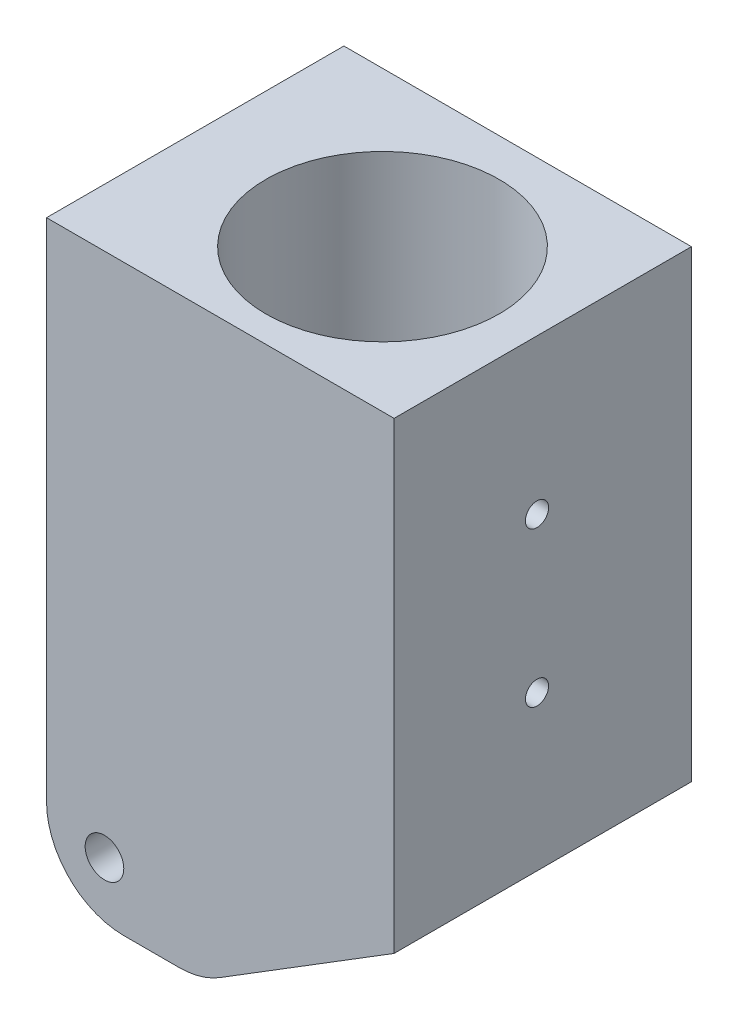
ISO-10303-21;
HEADER;
FILE_DESCRIPTION(('STEP AP214'),'2;1');
FILE_NAME('part.step','',(''),(''),'','','');
FILE_SCHEMA(('AUTOMOTIVE_DESIGN { 1 0 10303 214 1 1 1 1 }'));
ENDSEC;
DATA;
#1=APPLICATION_CONTEXT('core data for automotive mechanical design processes');
#2=APPLICATION_PROTOCOL_DEFINITION('international standard','automotive_design',2000,#1);
#3=PRODUCT_CONTEXT('',#1,'mechanical');
#4=PRODUCT('Part','Part','',(#3));
#5=PRODUCT_RELATED_PRODUCT_CATEGORY('part','',(#4));
#6=PRODUCT_DEFINITION_FORMATION('','',#4);
#7=PRODUCT_DEFINITION_CONTEXT('part definition',#1,'design');
#8=PRODUCT_DEFINITION('design','',#6,#7);
#9=PRODUCT_DEFINITION_SHAPE('','',#8);
#10=(LENGTH_UNIT() NAMED_UNIT(*) SI_UNIT(.MILLI.,.METRE.));
#11=(NAMED_UNIT(*) PLANE_ANGLE_UNIT() SI_UNIT($,.RADIAN.));
#12=(NAMED_UNIT(*) SI_UNIT($,.STERADIAN.) SOLID_ANGLE_UNIT());
#13=UNCERTAINTY_MEASURE_WITH_UNIT(LENGTH_MEASURE(1.E-05),#10,'distance_accuracy_value','');
#14=(GEOMETRIC_REPRESENTATION_CONTEXT(3) GLOBAL_UNCERTAINTY_ASSIGNED_CONTEXT((#13)) GLOBAL_UNIT_ASSIGNED_CONTEXT((#10,
#11,#12)) REPRESENTATION_CONTEXT('',''));
#15=CARTESIAN_POINT('',(0.,0.,0.));
#16=DIRECTION('',(0.,0.,1.));
#17=DIRECTION('',(1.,0.,0.));
#18=AXIS2_PLACEMENT_3D('',#15,#16,#17);
#19=CARTESIAN_POINT('',(20.,60.,-20.));
#20=DIRECTION('',(-1.,0.,0.));
#21=DIRECTION('',(0.,0.,1.));
#22=AXIS2_PLACEMENT_3D('',#19,#20,#21);
#23=PLANE('',#22);
#24=CARTESIAN_POINT('',(20.,40.,0.));
#25=DIRECTION('',(1.,0.,0.));
#26=DIRECTION('',(0.,0.,-1.));
#27=AXIS2_PLACEMENT_3D('',#24,#25,#26);
#28=CIRCLE('',#27,1.5);
#29=CARTESIAN_POINT('',(20.,40.,-1.5));
#30=VERTEX_POINT('',#29);
#31=EDGE_CURVE('E256',#30,#30,#28,.T.);
#32=ORIENTED_EDGE('',*,*,#31,.F.);
#33=EDGE_LOOP('',(#32));
#34=FACE_BOUND('',#33,.T.);
#35=CARTESIAN_POINT('',(20.,20.,0.));
#36=DIRECTION('',(1.,0.,0.));
#37=DIRECTION('',(0.,0.,-1.));
#38=AXIS2_PLACEMENT_3D('',#35,#36,#37);
#39=CIRCLE('',#38,1.5);
#40=CARTESIAN_POINT('',(20.,20.,-1.5));
#41=VERTEX_POINT('',#40);
#42=EDGE_CURVE('E246',#41,#41,#39,.T.);
#43=ORIENTED_EDGE('',*,*,#42,.F.);
#44=EDGE_LOOP('',(#43));
#45=FACE_BOUND('',#44,.T.);
#46=DIRECTION('',(0.,0.,-1.));
#47=VECTOR('',#46,1.);
#48=CARTESIAN_POINT('',(20.,0.,-20.));
#49=LINE('',#48,#47);
#50=CARTESIAN_POINT('',(20.,0.,18.5));
#51=VERTEX_POINT('',#50);
#52=CARTESIAN_POINT('',(20.,0.,13.5));
#53=VERTEX_POINT('',#52);
#54=EDGE_CURVE('E111',#51,#53,#49,.T.);
#55=ORIENTED_EDGE('',*,*,#54,.T.);
#56=CARTESIAN_POINT('',(20.,0.,-20.));
#57=VERTEX_POINT('',#56);
#58=EDGE_CURVE('E128',#53,#57,#49,.T.);
#59=ORIENTED_EDGE('',*,*,#58,.T.);
#60=DIRECTION('',(0.,-1.,0.));
#61=VECTOR('',#60,1.);
#62=CARTESIAN_POINT('',(20.,60.,-20.));
#63=LINE('',#62,#61);
#64=CARTESIAN_POINT('',(20.,60.,-20.));
#65=VERTEX_POINT('',#64);
#66=EDGE_CURVE('E154',#65,#57,#63,.T.);
#67=ORIENTED_EDGE('',*,*,#66,.F.);
#68=DIRECTION('',(0.,0.,-1.));
#69=VECTOR('',#68,1.);
#70=CARTESIAN_POINT('',(20.,60.,-20.));
#71=LINE('',#70,#69);
#72=CARTESIAN_POINT('',(20.,60.,18.5));
#73=VERTEX_POINT('',#72);
#74=EDGE_CURVE('E146',#73,#65,#71,.T.);
#75=ORIENTED_EDGE('',*,*,#74,.F.);
#76=DIRECTION('',(0.,-1.,0.));
#77=VECTOR('',#76,1.);
#78=CARTESIAN_POINT('',(20.,60.,18.5));
#79=LINE('',#78,#77);
#80=EDGE_CURVE('E138',#73,#51,#79,.T.);
#81=ORIENTED_EDGE('',*,*,#80,.T.);
#82=EDGE_LOOP('',(#55,#59,#67,#75,#81));
#83=FACE_BOUND('',#82,.T.);
#84=ADVANCED_FACE('F39',(#34,#45,#83),#23,.F.);
#85=CARTESIAN_POINT('',(-25.,60.,-20.));
#86=DIRECTION('',(0.,0.,1.));
#87=DIRECTION('',(1.,0.,0.));
#88=AXIS2_PLACEMENT_3D('',#85,#86,#87);
#89=PLANE('',#88);
#90=DIRECTION('',(-1.,0.,0.));
#91=VECTOR('',#90,1.);
#92=CARTESIAN_POINT('',(-25.,0.,-20.));
#93=LINE('',#92,#91);
#94=CARTESIAN_POINT('',(-25.,0.,-20.));
#95=VERTEX_POINT('',#94);
#96=EDGE_CURVE('E130',#57,#95,#93,.T.);
#97=ORIENTED_EDGE('',*,*,#96,.T.);
#98=DIRECTION('',(0.,-1.,0.));
#99=VECTOR('',#98,1.);
#100=CARTESIAN_POINT('',(-25.,60.,-20.));
#101=LINE('',#100,#99);
#102=CARTESIAN_POINT('',(-25.,60.,-20.));
#103=VERTEX_POINT('',#102);
#104=EDGE_CURVE('E151',#103,#95,#101,.T.);
#105=ORIENTED_EDGE('',*,*,#104,.F.);
#106=DIRECTION('',(-1.,0.,0.));
#107=VECTOR('',#106,1.);
#108=CARTESIAN_POINT('',(-25.,60.,-20.));
#109=LINE('',#108,#107);
#110=EDGE_CURVE('E284',#65,#103,#109,.T.);
#111=ORIENTED_EDGE('',*,*,#110,.F.);
#112=ORIENTED_EDGE('',*,*,#66,.T.);
#113=EDGE_LOOP('',(#97,#105,#111,#112));
#114=FACE_BOUND('',#113,.T.);
#115=ADVANCED_FACE('F207',(#114),#89,.F.);
#116=CARTESIAN_POINT('',(-25.,60.,-20.));
#117=DIRECTION('',(1.,0.,0.));
#118=DIRECTION('',(0.,0.,-1.));
#119=AXIS2_PLACEMENT_3D('',#116,#117,#118);
#120=PLANE('',#119);
#121=CARTESIAN_POINT('',(-25.,40.,0.));
#122=DIRECTION('',(1.,0.,0.));
#123=DIRECTION('',(0.,0.,-1.));
#124=AXIS2_PLACEMENT_3D('',#121,#122,#123);
#125=CIRCLE('',#124,1.5);
#126=CARTESIAN_POINT('',(-25.,40.,-1.5));
#127=VERTEX_POINT('',#126);
#128=EDGE_CURVE('E252',#127,#127,#125,.T.);
#129=ORIENTED_EDGE('',*,*,#128,.T.);
#130=EDGE_LOOP('',(#129));
#131=FACE_BOUND('',#130,.T.);
#132=CARTESIAN_POINT('',(-25.,20.,0.));
#133=DIRECTION('',(1.,0.,0.));
#134=DIRECTION('',(0.,0.,-1.));
#135=AXIS2_PLACEMENT_3D('',#132,#133,#134);
#136=CIRCLE('',#135,1.5);
#137=CARTESIAN_POINT('',(-25.,20.,-1.5));
#138=VERTEX_POINT('',#137);
#139=EDGE_CURVE('E166',#138,#138,#136,.T.);
#140=ORIENTED_EDGE('',*,*,#139,.T.);
#141=EDGE_LOOP('',(#140));
#142=FACE_BOUND('',#141,.T.);
#143=DIRECTION('',(0.,-1.,0.));
#144=VECTOR('',#143,1.);
#145=CARTESIAN_POINT('',(-25.,0.,13.5));
#146=LINE('',#145,#144);
#147=CARTESIAN_POINT('',(-25.,0.,13.5));
#148=VERTEX_POINT('',#147);
#149=CARTESIAN_POINT('',(-25.,-5.50000000000001,13.5));
#150=VERTEX_POINT('',#149);
#151=EDGE_CURVE('E121',#148,#150,#146,.T.);
#152=ORIENTED_EDGE('',*,*,#151,.T.);
#153=DIRECTION('',(0.,0.,1.));
#154=VECTOR('',#153,1.);
#155=CARTESIAN_POINT('',(-25.,-5.50000000000001,18.5));
#156=LINE('',#155,#154);
#157=CARTESIAN_POINT('',(-25.,-5.50000000000001,18.5));
#158=VERTEX_POINT('',#157);
#159=EDGE_CURVE('E11',#150,#158,#156,.T.);
#160=ORIENTED_EDGE('',*,*,#159,.T.);
#161=DIRECTION('',(0.,-1.,0.));
#162=VECTOR('',#161,1.);
#163=CARTESIAN_POINT('',(-25.,60.,18.5));
#164=LINE('',#163,#162);
#165=CARTESIAN_POINT('',(-25.,60.,18.5));
#166=VERTEX_POINT('',#165);
#167=EDGE_CURVE('E148',#166,#158,#164,.T.);
#168=ORIENTED_EDGE('',*,*,#167,.F.);
#169=DIRECTION('',(0.,0.,1.));
#170=VECTOR('',#169,1.);
#171=CARTESIAN_POINT('',(-25.,60.,-20.));
#172=LINE('',#171,#170);
#173=EDGE_CURVE('E285',#103,#166,#172,.T.);
#174=ORIENTED_EDGE('',*,*,#173,.F.);
#175=ORIENTED_EDGE('',*,*,#104,.T.);
#176=DIRECTION('',(0.,0.,1.));
#177=VECTOR('',#176,1.);
#178=CARTESIAN_POINT('',(-25.,0.,-20.));
#179=LINE('',#178,#177);
#180=EDGE_CURVE('E139',#95,#148,#179,.T.);
#181=ORIENTED_EDGE('',*,*,#180,.T.);
#182=EDGE_LOOP('',(#152,#160,#168,#174,#175,#181));
#183=FACE_BOUND('',#182,.T.);
#184=ADVANCED_FACE('F213',(#131,#142,#183),#120,.F.);
#185=CARTESIAN_POINT('',(-25.,60.,18.5));
#186=DIRECTION('',(0.,0.,-1.));
#187=DIRECTION('',(-1.,0.,0.));
#188=AXIS2_PLACEMENT_3D('',#185,#186,#187);
#189=PLANE('',#188);
#190=DIRECTION('',(1.,0.,0.));
#191=VECTOR('',#190,1.);
#192=CARTESIAN_POINT('',(-25.,-15.5,18.5));
#193=LINE('',#192,#191);
#194=CARTESIAN_POINT('',(-15.,-15.5,18.5));
#195=VERTEX_POINT('',#194);
#196=CARTESIAN_POINT('',(-7.84847236139706,-15.5,18.5));
#197=VERTEX_POINT('',#196);
#198=EDGE_CURVE('E270',#195,#197,#193,.T.);
#199=ORIENTED_EDGE('',*,*,#198,.T.);
#200=CARTESIAN_POINT('',(-7.84847236139706,-5.5,18.5));
#201=DIRECTION('',(0.,0.,-1.));
#202=DIRECTION('',(-1.,0.,0.));
#203=AXIS2_PLACEMENT_3D('',#200,#201,#202);
#204=CIRCLE('',#203,10.);
#205=CARTESIAN_POINT('',(-2.57907567278031,-13.9990269171238,18.5));
#206=VERTEX_POINT('',#205);
#207=EDGE_CURVE('E235',#197,#206,#204,.F.);
#208=ORIENTED_EDGE('',*,*,#207,.T.);
#209=DIRECTION('',(0.849902691712379,0.526939668861675,0.));
#210=VECTOR('',#209,1.);
#211=CARTESIAN_POINT('',(-4.99999999999999,-15.5,18.5));
#212=LINE('',#211,#210);
#213=EDGE_CURVE('E125',#206,#51,#212,.T.);
#214=ORIENTED_EDGE('',*,*,#213,.T.);
#215=ORIENTED_EDGE('',*,*,#80,.F.);
#216=DIRECTION('',(1.,0.,0.));
#217=VECTOR('',#216,1.);
#218=CARTESIAN_POINT('',(-25.,60.,18.5));
#219=LINE('',#218,#217);
#220=EDGE_CURVE('E142',#166,#73,#219,.T.);
#221=ORIENTED_EDGE('',*,*,#220,.F.);
#222=ORIENTED_EDGE('',*,*,#167,.T.);
#223=CARTESIAN_POINT('',(-15.,-5.50000000000001,18.5));
#224=DIRECTION('',(0.,0.,-1.));
#225=DIRECTION('',(-1.,0.,0.));
#226=AXIS2_PLACEMENT_3D('',#223,#224,#225);
#227=CIRCLE('',#226,10.);
#228=EDGE_CURVE('E237',#158,#195,#227,.F.);
#229=ORIENTED_EDGE('',*,*,#228,.T.);
#230=EDGE_LOOP('',(#199,#208,#214,#215,#221,#222,#229));
#231=FACE_BOUND('',#230,.T.);
#232=CARTESIAN_POINT('',(-17.5,-8.00000000000001,18.5));
#233=DIRECTION('',(0.,0.,1.));
#234=DIRECTION('',(1.,0.,0.));
#235=AXIS2_PLACEMENT_3D('',#232,#233,#234);
#236=CIRCLE('',#235,2.5);
#237=CARTESIAN_POINT('',(-15.,-8.00000000000001,18.5));
#238=VERTEX_POINT('',#237);
#239=EDGE_CURVE('E271',#238,#238,#236,.T.);
#240=ORIENTED_EDGE('',*,*,#239,.F.);
#241=EDGE_LOOP('',(#240));
#242=FACE_BOUND('',#241,.T.);
#243=ADVANCED_FACE('F292',(#231,#242),#189,.F.);
#244=CARTESIAN_POINT('',(0.,60.,0.));
#245=DIRECTION('',(0.,1.,0.));
#246=DIRECTION('',(0.,0.,1.));
#247=AXIS2_PLACEMENT_3D('',#244,#245,#246);
#248=PLANE('',#247);
#249=CARTESIAN_POINT('',(0.,60.,0.));
#250=DIRECTION('',(0.,1.,0.));
#251=DIRECTION('',(0.,0.,1.));
#252=AXIS2_PLACEMENT_3D('',#249,#250,#251);
#253=CIRCLE('',#252,15.1);
#254=CARTESIAN_POINT('',(0.,60.,15.1));
#255=VERTEX_POINT('',#254);
#256=EDGE_CURVE('E114',#255,#255,#253,.T.);
#257=ORIENTED_EDGE('',*,*,#256,.F.);
#258=EDGE_LOOP('',(#257));
#259=FACE_BOUND('',#258,.T.);
#260=ORIENTED_EDGE('',*,*,#74,.T.);
#261=ORIENTED_EDGE('',*,*,#110,.T.);
#262=ORIENTED_EDGE('',*,*,#173,.T.);
#263=ORIENTED_EDGE('',*,*,#220,.T.);
#264=EDGE_LOOP('',(#260,#261,#262,#263));
#265=FACE_BOUND('',#264,.T.);
#266=ADVANCED_FACE('F290',(#259,#265),#248,.T.);
#267=CARTESIAN_POINT('',(0.,0.,0.));
#268=DIRECTION('',(0.,1.,0.));
#269=DIRECTION('',(0.,0.,1.));
#270=AXIS2_PLACEMENT_3D('',#267,#268,#269);
#271=PLANE('',#270);
#272=ORIENTED_EDGE('',*,*,#58,.F.);
#273=DIRECTION('',(-1.,0.,0.));
#274=VECTOR('',#273,1.);
#275=CARTESIAN_POINT('',(20.,0.,13.5));
#276=LINE('',#275,#274);
#277=EDGE_CURVE('E118',#53,#148,#276,.T.);
#278=ORIENTED_EDGE('',*,*,#277,.T.);
#279=ORIENTED_EDGE('',*,*,#180,.F.);
#280=ORIENTED_EDGE('',*,*,#96,.F.);
#281=EDGE_LOOP('',(#272,#278,#279,#280));
#282=FACE_BOUND('',#281,.T.);
#283=ADVANCED_FACE('F129',(#282),#271,.F.);
#284=CARTESIAN_POINT('',(0.,9.99999999999999,0.));
#285=DIRECTION('',(0.,1.,0.));
#286=DIRECTION('',(0.,0.,1.));
#287=AXIS2_PLACEMENT_3D('',#284,#285,#286);
#288=CYLINDRICAL_SURFACE('',#287,15.1);
#289=CARTESIAN_POINT('',(-15.0253119767944,40.,-1.5));
#290=CARTESIAN_POINT('',(-15.025312956074,39.9159676620919,-1.49999635854613));
#291=CARTESIAN_POINT('',(-15.0260245276725,39.8318796909114,-1.49291478510042));
#292=CARTESIAN_POINT('',(-15.028793551497,39.6660349131521,-1.46477185820528));
#293=CARTESIAN_POINT('',(-15.03085248871,39.5842807826705,-1.44369507968879));
#294=CARTESIAN_POINT('',(-15.0360807748948,39.4255293978987,-1.38818135253405));
#295=CARTESIAN_POINT('',(-15.0392494524589,39.3485293004147,-1.35375248074173));
#296=CARTESIAN_POINT('',(-15.0463393621317,39.201417488061,-1.27252733745513));
#297=CARTESIAN_POINT('',(-15.05026044424,39.1313044043924,-1.22573353035035));
#298=CARTESIAN_POINT('',(-15.0584291270942,38.9996884271419,-1.12092628167147));
#299=CARTESIAN_POINT('',(-15.0626777301768,38.9382137328839,-1.06287750232365));
#300=CARTESIAN_POINT('',(-15.0710136412484,38.8258623723675,-0.937283575420635));
#301=CARTESIAN_POINT('',(-15.0751009418651,38.7749861900552,-0.869737994461097));
#302=CARTESIAN_POINT('',(-15.0826635983521,38.6851787557144,-0.72689531541232));
#303=CARTESIAN_POINT('',(-15.0861376707466,38.6462724329321,-0.651582470180894));
#304=CARTESIAN_POINT('',(-15.0920715347339,38.5816686124249,-0.495452469131725));
#305=CARTESIAN_POINT('',(-15.0945313507482,38.5559707966588,-0.414635445899537));
#306=CARTESIAN_POINT('',(-15.0981525138302,38.5185960854439,-0.250075883600477));
#307=CARTESIAN_POINT('',(-15.0993181456551,38.5068729134921,-0.166343950618246));
#308=CARTESIAN_POINT('',(-15.100234174601,38.4976370858915,0.00190655759439224));
#309=CARTESIAN_POINT('',(-15.0999846079687,38.5001240662856,0.0864251126221104));
#310=CARTESIAN_POINT('',(-15.0981018679929,38.5192003682383,0.253535560434281));
#311=CARTESIAN_POINT('',(-15.0964735769364,38.5357399280402,0.336133196401713));
#312=CARTESIAN_POINT('',(-15.0920219994832,38.5823743756564,0.497374352123941));
#313=CARTESIAN_POINT('',(-15.0891986977396,38.612469437557,0.576017821082989));
#314=CARTESIAN_POINT('',(-15.0826661343107,38.685415201237,0.727275160741129));
#315=CARTESIAN_POINT('',(-15.0789553445811,38.7282879348315,0.799878337650498));
#316=CARTESIAN_POINT('',(-15.0710642123586,38.8255560438999,0.936877465459625));
#317=CARTESIAN_POINT('',(-15.0668838562791,38.879951752825,1.00127317876582));
#318=CARTESIAN_POINT('',(-15.0585014337633,38.9990016032106,1.12032085957513));
#319=CARTESIAN_POINT('',(-15.054299351531,39.0636990304483,1.17492954862421));
#320=CARTESIAN_POINT('',(-15.0463651004589,39.201365684078,1.27251801061355));
#321=CARTESIAN_POINT('',(-15.0426329322861,39.2743349222103,1.31549776704826));
#322=CARTESIAN_POINT('',(-15.0360607178808,39.426507005085,1.38860805601259));
#323=CARTESIAN_POINT('',(-15.0332208560381,39.505711134007,1.41873593323833));
#324=CARTESIAN_POINT('',(-15.0287585753405,39.6680883326636,1.46525308871646));
#325=CARTESIAN_POINT('',(-15.0271361198954,39.7512612830321,1.48164277988374));
#326=CARTESIAN_POINT('',(-15.0252986591232,39.9188352636901,1.50016268663854));
#327=CARTESIAN_POINT('',(-15.0250776785925,40.0032295405848,1.50235344042828));
#328=CARTESIAN_POINT('',(-15.0260524182927,40.1711840102969,1.49257225368717));
#329=CARTESIAN_POINT('',(-15.0272481196383,40.2547442142182,1.48060050195128));
#330=CARTESIAN_POINT('',(-15.0309160596127,40.4184822238691,1.44288477969783));
#331=CARTESIAN_POINT('',(-15.0333856461404,40.4986666838852,1.41716941799686));
#332=CARTESIAN_POINT('',(-15.0393209391003,40.6535838762131,1.35272564260952));
#333=CARTESIAN_POINT('',(-15.0427866680578,40.7283164851969,1.31399693465547));
#334=CARTESIAN_POINT('',(-15.0503382064572,40.8704845722181,1.2244741127262));
#335=CARTESIAN_POINT('',(-15.0544260614167,40.9378946728515,1.17363987299589));
#336=CARTESIAN_POINT('',(-15.0627545443571,41.0632469104025,1.06140651663175));
#337=CARTESIAN_POINT('',(-15.0669951760684,41.1211888159303,1.00000714187558));
#338=CARTESIAN_POINT('',(-15.0751694218504,41.2261685790411,0.868123835144984));
#339=CARTESIAN_POINT('',(-15.0791018911967,41.2731669510903,0.797608391658785));
#340=CARTESIAN_POINT('',(-15.0862000664518,41.3546538558809,0.649650329668302));
#341=CARTESIAN_POINT('',(-15.0893657827459,41.389142558064,0.572207805008101));
#342=CARTESIAN_POINT('',(-15.0945685839412,41.4445641728181,0.412731881610149));
#343=CARTESIAN_POINT('',(-15.0966076555916,41.4655209589395,0.330706846940061));
#344=CARTESIAN_POINT('',(-15.099335565752,41.4933617737986,0.164281005364229));
#345=CARTESIAN_POINT('',(-15.1000244416734,41.5002461924544,0.0798802643504145));
#346=CARTESIAN_POINT('',(-15.0999743264919,41.4997414076765,-0.0885132586038637));
#347=CARTESIAN_POINT('',(-15.0992414683536,41.4924135122405,-0.172506232884098));
#348=CARTESIAN_POINT('',(-15.096442335095,41.4638206390987,-0.338061727779914));
#349=CARTESIAN_POINT('',(-15.0943760588904,41.4425556500599,-0.419624246419131));
#350=CARTESIAN_POINT('',(-15.0891416171645,41.3867091488097,-0.578003288244201));
#351=CARTESIAN_POINT('',(-15.0859735976019,41.3521294004693,-0.654820438508598));
#352=CARTESIAN_POINT('',(-15.078888864656,41.2706415319087,-0.801569837575121));
#353=CARTESIAN_POINT('',(-15.0749721559724,41.2237334890742,-0.871502129590262));
#354=CARTESIAN_POINT('',(-15.0668086636542,41.1186906745015,-1.00281085394436));
#355=CARTESIAN_POINT('',(-15.0625605816352,41.0605102643219,-1.06415069694839));
#356=CARTESIAN_POINT('',(-15.0542241088092,40.9346639349868,-1.17622425255196));
#357=CARTESIAN_POINT('',(-15.050135756584,40.8669957419999,-1.22695541540431));
#358=CARTESIAN_POINT('',(-15.042570630608,40.7239089433625,-1.31647186691678));
#359=CARTESIAN_POINT('',(-15.0390954200226,40.6484712829841,-1.35522680653066));
#360=CARTESIAN_POINT('',(-15.0331686996374,40.4921729527212,-1.41946790711139));
#361=CARTESIAN_POINT('',(-15.0307160348248,40.4113185218565,-1.444969046934));
#362=CARTESIAN_POINT('',(-15.0277311589647,40.2750045514355,-1.47561362318629));
#363=CARTESIAN_POINT('',(-15.0268282506956,40.2204167180033,-1.48474603116336));
#364=CARTESIAN_POINT('',(-15.0256183386627,40.1105606166398,-1.49694040505908));
#365=CARTESIAN_POINT('',(-15.0253113324391,40.0552923515182,-1.50000239603648));
#366=CARTESIAN_POINT('',(-15.0253119767944,40.,-1.5));
#367=B_SPLINE_CURVE_WITH_KNOTS('',3,(#289,#290,#291,#292,#293,#294,#295,#296,#297,#298,#299,
#300,#301,#302,#303,#304,#305,#306,#307,#308,#309,#310,#311,#312,#313,#314,#315,#316,#317,#318,
#319,#320,#321,#322,#323,#324,#325,#326,#327,#328,#329,#330,#331,#332,#333,#334,#335,#336,#337,
#338,#339,#340,#341,#342,#343,#344,#345,#346,#347,#348,#349,#350,#351,#352,#353,#354,#355,#356,
#357,#358,#359,#360,#361,#362,#363,#364,#365,#366),.UNSPECIFIED.,.T.,.F.,(4,2,2,2,2,2,2,2,2,2,2,
2,2,2,2,2,2,2,2,2,2,2,2,2,2,2,2,2,2,2,2,2,2,2,2,2,2,2,4),(0.,0.251895097196481,0.50406828696038,
0.75608917138904,1.00805986471088,1.26083488254587,1.51362143998953,1.76693095868192,
2.02023437776912,2.27269664114699,2.52515243837155,2.77671796950038,3.02828673144791,
3.28029179364622,3.53230414935096,3.7854047994611,4.03850580880849,4.29165908560718,
4.54480475335873,4.79687040216313,5.04893269081456,5.30047231646477,5.552017630503,
5.80440863162633,6.05680579992193,6.31010000309801,6.56339077531053,6.81623345189484,
7.06906912260185,7.32081655553196,7.57256419316889,7.82427849203737,8.07599121091297,
8.32874517901135,8.58155982571251,8.83500997565597,9.08817306120623,9.25391794111063,
9.41966213681694),.UNSPECIFIED.);
#368=CARTESIAN_POINT('',(-15.0253119767944,40.,-1.5));
#369=VERTEX_POINT('',#368);
#370=EDGE_CURVE('E241',#369,#369,#367,.T.);
#371=ORIENTED_EDGE('',*,*,#370,.T.);
#372=EDGE_LOOP('',(#371));
#373=FACE_BOUND('',#372,.T.);
#374=CARTESIAN_POINT('',(15.0253119767944,40.,-1.5));
#375=CARTESIAN_POINT('',(15.025312956074,40.0840323379081,-1.49999635854613));
#376=CARTESIAN_POINT('',(15.0260245276725,40.1681203090886,-1.49291478510043));
#377=CARTESIAN_POINT('',(15.028793551497,40.3339650868479,-1.46477185820529));
#378=CARTESIAN_POINT('',(15.03085248871,40.4157192173295,-1.44369507968879));
#379=CARTESIAN_POINT('',(15.0360807748948,40.5744706021013,-1.38818135253405));
#380=CARTESIAN_POINT('',(15.0392494524589,40.6514706995853,-1.35375248074173));
#381=CARTESIAN_POINT('',(15.0463393621317,40.798582511939,-1.27252733745513));
#382=CARTESIAN_POINT('',(15.05026044424,40.8686955956076,-1.22573353035035));
#383=CARTESIAN_POINT('',(15.0584291270942,41.0003115728581,-1.12092628167147));
#384=CARTESIAN_POINT('',(15.0626777301768,41.0617862671161,-1.06287750232365));
#385=CARTESIAN_POINT('',(15.0710136412484,41.1741376276325,-0.937283575420637));
#386=CARTESIAN_POINT('',(15.0751009418651,41.2250138099448,-0.869737994461099));
#387=CARTESIAN_POINT('',(15.0826635983521,41.3148212442856,-0.726895315412323));
#388=CARTESIAN_POINT('',(15.0861376707466,41.3537275670679,-0.651582470180897));
#389=CARTESIAN_POINT('',(15.0920715347339,41.4183313875751,-0.495452469131728));
#390=CARTESIAN_POINT('',(15.0945313507482,41.4440292033412,-0.41463544589954));
#391=CARTESIAN_POINT('',(15.0981525138302,41.4814039145561,-0.250075883600479));
#392=CARTESIAN_POINT('',(15.0993181456551,41.4931270865079,-0.166343950618248));
#393=CARTESIAN_POINT('',(15.100234174601,41.5023629141085,0.00190655759438945));
#394=CARTESIAN_POINT('',(15.0999846079687,41.4998759337144,0.0864251126221078));
#395=CARTESIAN_POINT('',(15.0981018679929,41.4807996317617,0.253535560434279));
#396=CARTESIAN_POINT('',(15.0964735769364,41.4642600719598,0.33613319640171));
#397=CARTESIAN_POINT('',(15.0920219994832,41.4176256243436,0.497374352123939));
#398=CARTESIAN_POINT('',(15.0891986977396,41.387530562443,0.576017821082986));
#399=CARTESIAN_POINT('',(15.0826661343107,41.314584798763,0.727275160741127));
#400=CARTESIAN_POINT('',(15.0789553445811,41.2717120651685,0.799878337650496));
#401=CARTESIAN_POINT('',(15.0710642123586,41.1744439561001,0.936877465459623));
#402=CARTESIAN_POINT('',(15.0668838562791,41.120048247175,1.00127317876582));
#403=CARTESIAN_POINT('',(15.0585014337633,41.0009983967895,1.12032085957512));
#404=CARTESIAN_POINT('',(15.054299351531,40.9363009695517,1.1749295486242));
#405=CARTESIAN_POINT('',(15.0463651004589,40.798634315922,1.27251801061355));
#406=CARTESIAN_POINT('',(15.0426329322861,40.7256650777897,1.31549776704826));
#407=CARTESIAN_POINT('',(15.0360607178808,40.573492994915,1.38860805601259));
#408=CARTESIAN_POINT('',(15.0332208560381,40.494288865993,1.41873593323833));
#409=CARTESIAN_POINT('',(15.0287585753405,40.3319116673364,1.46525308871646));
#410=CARTESIAN_POINT('',(15.0271361198954,40.2487387169679,1.48164277988374));
#411=CARTESIAN_POINT('',(15.0252986591232,40.0811647363099,1.50016268663854));
#412=CARTESIAN_POINT('',(15.0250776785925,39.9967704594153,1.50235344042828));
#413=CARTESIAN_POINT('',(15.0260524182927,39.8288159897031,1.49257225368717));
#414=CARTESIAN_POINT('',(15.0272481196383,39.7452557857818,1.48060050195127));
#415=CARTESIAN_POINT('',(15.0309160596127,39.5815177761309,1.44288477969783));
#416=CARTESIAN_POINT('',(15.0333856461404,39.5013333161147,1.41716941799686));
#417=CARTESIAN_POINT('',(15.0393209391003,39.3464161237869,1.35272564260952));
#418=CARTESIAN_POINT('',(15.0427866680578,39.2716835148031,1.31399693465547));
#419=CARTESIAN_POINT('',(15.0503382064572,39.1295154277819,1.2244741127262));
#420=CARTESIAN_POINT('',(15.0544260614167,39.0621053271485,1.17363987299589));
#421=CARTESIAN_POINT('',(15.0627545443571,38.9367530895975,1.06140651663175));
#422=CARTESIAN_POINT('',(15.0669951760684,38.8788111840697,1.00000714187558));
#423=CARTESIAN_POINT('',(15.0751694218504,38.7738314209589,0.868123835144981));
#424=CARTESIAN_POINT('',(15.0791018911967,38.7268330489097,0.797608391658783));
#425=CARTESIAN_POINT('',(15.0862000664518,38.6453461441191,0.6496503296683));
#426=CARTESIAN_POINT('',(15.0893657827459,38.610857441936,0.572207805008099));
#427=CARTESIAN_POINT('',(15.0945685839412,38.5554358271819,0.412731881610147));
#428=CARTESIAN_POINT('',(15.0966076555916,38.5344790410605,0.330706846940059));
#429=CARTESIAN_POINT('',(15.099335565752,38.5066382262014,0.164281005364227));
#430=CARTESIAN_POINT('',(15.1000244416734,38.4997538075456,0.0798802643504122));
#431=CARTESIAN_POINT('',(15.0999743264919,38.5002585923235,-0.0885132586038663));
#432=CARTESIAN_POINT('',(15.0992414683536,38.5075864877595,-0.172506232884101));
#433=CARTESIAN_POINT('',(15.096442335095,38.5361793609014,-0.338061727779917));
#434=CARTESIAN_POINT('',(15.0943760588904,38.5574443499401,-0.419624246419134));
#435=CARTESIAN_POINT('',(15.0891416171645,38.6132908511903,-0.578003288244204));
#436=CARTESIAN_POINT('',(15.0859735976019,38.6478705995307,-0.654820438508601));
#437=CARTESIAN_POINT('',(15.078888864656,38.7293584680913,-0.801569837575125));
#438=CARTESIAN_POINT('',(15.0749721559724,38.7762665109258,-0.871502129590266));
#439=CARTESIAN_POINT('',(15.0668086636542,38.8813093254985,-1.00281085394436));
#440=CARTESIAN_POINT('',(15.0625605816352,38.9394897356781,-1.06415069694839));
#441=CARTESIAN_POINT('',(15.0542241088092,39.0653360650132,-1.17622425255196));
#442=CARTESIAN_POINT('',(15.050135756584,39.1330042580001,-1.22695541540432));
#443=CARTESIAN_POINT('',(15.042570630608,39.2760910566375,-1.31647186691678));
#444=CARTESIAN_POINT('',(15.0390954200226,39.3515287170159,-1.35522680653066));
#445=CARTESIAN_POINT('',(15.0331686996374,39.5078270472788,-1.4194679071114));
#446=CARTESIAN_POINT('',(15.0307160348248,39.5886814781435,-1.44496904693401));
#447=CARTESIAN_POINT('',(15.0277311589647,39.7249954485645,-1.47561362318629));
#448=CARTESIAN_POINT('',(15.0268282506956,39.7795832819967,-1.48474603116336));
#449=CARTESIAN_POINT('',(15.0256183386627,39.8894393833602,-1.49694040505908));
#450=CARTESIAN_POINT('',(15.0253113324391,39.9447076484818,-1.50000239603649));
#451=CARTESIAN_POINT('',(15.0253119767944,40.,-1.5));
#452=B_SPLINE_CURVE_WITH_KNOTS('',3,(#374,#375,#376,#377,#378,#379,#380,#381,#382,#383,#384,
#385,#386,#387,#388,#389,#390,#391,#392,#393,#394,#395,#396,#397,#398,#399,#400,#401,#402,#403,
#404,#405,#406,#407,#408,#409,#410,#411,#412,#413,#414,#415,#416,#417,#418,#419,#420,#421,#422,
#423,#424,#425,#426,#427,#428,#429,#430,#431,#432,#433,#434,#435,#436,#437,#438,#439,#440,#441,
#442,#443,#444,#445,#446,#447,#448,#449,#450,#451),.UNSPECIFIED.,.T.,.F.,(4,2,2,2,2,2,2,2,2,2,2,
2,2,2,2,2,2,2,2,2,2,2,2,2,2,2,2,2,2,2,2,2,2,2,2,2,2,2,4),(0.,0.251895097196481,0.50406828696038,
0.75608917138904,1.00805986471088,1.26083488254587,1.51362143998953,1.76693095868192,
2.02023437776912,2.27269664114698,2.52515243837155,2.77671796950038,3.02828673144791,
3.28029179364622,3.53230414935096,3.7854047994611,4.03850580880849,4.29165908560718,
4.54480475335873,4.79687040216313,5.04893269081457,5.30047231646477,5.552017630503,
5.80440863162633,6.05680579992193,6.31010000309801,6.56339077531053,6.81623345189484,
7.06906912260185,7.32081655553196,7.57256419316889,7.82427849203737,8.07599121091297,
8.32874517901135,8.58155982571251,8.83500997565596,9.08817306120623,9.25391794111063,
9.41966213681694),.UNSPECIFIED.);
#453=CARTESIAN_POINT('',(15.0253119767944,40.,-1.5));
#454=VERTEX_POINT('',#453);
#455=EDGE_CURVE('E247',#454,#454,#452,.T.);
#456=ORIENTED_EDGE('',*,*,#455,.T.);
#457=EDGE_LOOP('',(#456));
#458=FACE_BOUND('',#457,.T.);
#459=CARTESIAN_POINT('',(-15.0253119767944,20.,-1.5));
#460=CARTESIAN_POINT('',(-15.025312956074,19.9159676620919,-1.49999635854613));
#461=CARTESIAN_POINT('',(-15.0260245276725,19.8318796909114,-1.49291478510042));
#462=CARTESIAN_POINT('',(-15.028793551497,19.6660349131521,-1.46477185820528));
#463=CARTESIAN_POINT('',(-15.03085248871,19.5842807826705,-1.44369507968879));
#464=CARTESIAN_POINT('',(-15.0360807748948,19.4255293978987,-1.38818135253405));
#465=CARTESIAN_POINT('',(-15.0392494524589,19.3485293004147,-1.35375248074173));
#466=CARTESIAN_POINT('',(-15.0463393621317,19.201417488061,-1.27252733745513));
#467=CARTESIAN_POINT('',(-15.05026044424,19.1313044043924,-1.22573353035035));
#468=CARTESIAN_POINT('',(-15.0584291270942,18.9996884271419,-1.12092628167147));
#469=CARTESIAN_POINT('',(-15.0626777301768,18.9382137328839,-1.06287750232365));
#470=CARTESIAN_POINT('',(-15.0710136412484,18.8258623723675,-0.937283575420637));
#471=CARTESIAN_POINT('',(-15.0751009418651,18.7749861900552,-0.869737994461099));
#472=CARTESIAN_POINT('',(-15.0826635983521,18.6851787557144,-0.726895315412323));
#473=CARTESIAN_POINT('',(-15.0861376707466,18.6462724329321,-0.651582470180895));
#474=CARTESIAN_POINT('',(-15.0920715347339,18.5816686124249,-0.495452469131726));
#475=CARTESIAN_POINT('',(-15.0945313507482,18.5559707966588,-0.414635445899538));
#476=CARTESIAN_POINT('',(-15.0981525138302,18.5185960854439,-0.250075883600477));
#477=CARTESIAN_POINT('',(-15.0993181456551,18.5068729134921,-0.166343950618246));
#478=CARTESIAN_POINT('',(-15.100234174601,18.4976370858915,0.00190655759439107));
#479=CARTESIAN_POINT('',(-15.0999846079687,18.5001240662856,0.0864251126221093));
#480=CARTESIAN_POINT('',(-15.0981018679929,18.5192003682383,0.253535560434281));
#481=CARTESIAN_POINT('',(-15.0964735769364,18.5357399280402,0.336133196401712));
#482=CARTESIAN_POINT('',(-15.0920219994832,18.5823743756564,0.497374352123941));
#483=CARTESIAN_POINT('',(-15.0891986977396,18.612469437557,0.576017821082988));
#484=CARTESIAN_POINT('',(-15.0826661343107,18.685415201237,0.72727516074113));
#485=CARTESIAN_POINT('',(-15.0789553445811,18.7282879348315,0.7998783376505));
#486=CARTESIAN_POINT('',(-15.0710642123586,18.8255560438999,0.936877465459628));
#487=CARTESIAN_POINT('',(-15.0668838562791,18.879951752825,1.00127317876582));
#488=CARTESIAN_POINT('',(-15.0585014337633,18.9990016032106,1.12032085957513));
#489=CARTESIAN_POINT('',(-15.054299351531,19.0636990304484,1.17492954862421));
#490=CARTESIAN_POINT('',(-15.0463651004589,19.201365684078,1.27251801061355));
#491=CARTESIAN_POINT('',(-15.0426329322861,19.2743349222103,1.31549776704826));
#492=CARTESIAN_POINT('',(-15.0360607178808,19.426507005085,1.38860805601259));
#493=CARTESIAN_POINT('',(-15.0332208560381,19.505711134007,1.41873593323833));
#494=CARTESIAN_POINT('',(-15.0287585753405,19.6680883326636,1.46525308871646));
#495=CARTESIAN_POINT('',(-15.0271361198954,19.7512612830321,1.48164277988374));
#496=CARTESIAN_POINT('',(-15.0252986591232,19.9188352636901,1.50016268663855));
#497=CARTESIAN_POINT('',(-15.0250776785925,20.0032295405847,1.50235344042828));
#498=CARTESIAN_POINT('',(-15.0260524182927,20.1711840102969,1.49257225368717));
#499=CARTESIAN_POINT('',(-15.0272481196383,20.2547442142182,1.48060050195128));
#500=CARTESIAN_POINT('',(-15.0309160596127,20.4184822238692,1.44288477969783));
#501=CARTESIAN_POINT('',(-15.0333856461404,20.4986666838853,1.41716941799686));
#502=CARTESIAN_POINT('',(-15.0393209391003,20.6535838762131,1.35272564260952));
#503=CARTESIAN_POINT('',(-15.0427866680578,20.7283164851969,1.31399693465547));
#504=CARTESIAN_POINT('',(-15.0503382064572,20.8704845722181,1.2244741127262));
#505=CARTESIAN_POINT('',(-15.0544260614167,20.9378946728515,1.17363987299589));
#506=CARTESIAN_POINT('',(-15.0627545443571,21.0632469104025,1.06140651663175));
#507=CARTESIAN_POINT('',(-15.0669951760684,21.1211888159303,1.00000714187559));
#508=CARTESIAN_POINT('',(-15.0751694218504,21.2261685790411,0.868123835144984));
#509=CARTESIAN_POINT('',(-15.0791018911967,21.2731669510903,0.797608391658784));
#510=CARTESIAN_POINT('',(-15.0862000664518,21.3546538558809,0.6496503296683));
#511=CARTESIAN_POINT('',(-15.0893657827459,21.389142558064,0.572207805008099));
#512=CARTESIAN_POINT('',(-15.0945685839412,21.4445641728181,0.412731881610147));
#513=CARTESIAN_POINT('',(-15.0966076555916,21.4655209589395,0.330706846940058));
#514=CARTESIAN_POINT('',(-15.099335565752,21.4933617737986,0.164281005364226));
#515=CARTESIAN_POINT('',(-15.1000244416734,21.5002461924544,0.0798802643504116));
#516=CARTESIAN_POINT('',(-15.0999743264919,21.4997414076765,-0.0885132586038661));
#517=CARTESIAN_POINT('',(-15.0992414683536,21.4924135122405,-0.1725062328841));
#518=CARTESIAN_POINT('',(-15.096442335095,21.4638206390987,-0.338061727779915));
#519=CARTESIAN_POINT('',(-15.0943760588904,21.4425556500599,-0.419624246419132));
#520=CARTESIAN_POINT('',(-15.0891416171645,21.3867091488097,-0.578003288244201));
#521=CARTESIAN_POINT('',(-15.0859735976019,21.3521294004693,-0.654820438508597));
#522=CARTESIAN_POINT('',(-15.078888864656,21.2706415319087,-0.801569837575121));
#523=CARTESIAN_POINT('',(-15.0749721559724,21.2237334890742,-0.871502129590263));
#524=CARTESIAN_POINT('',(-15.0668086636542,21.1186906745015,-1.00281085394436));
#525=CARTESIAN_POINT('',(-15.0625605816352,21.0605102643219,-1.06415069694839));
#526=CARTESIAN_POINT('',(-15.0542241088092,20.9346639349868,-1.17622425255196));
#527=CARTESIAN_POINT('',(-15.050135756584,20.8669957419999,-1.22695541540431));
#528=CARTESIAN_POINT('',(-15.042570630608,20.7239089433625,-1.31647186691678));
#529=CARTESIAN_POINT('',(-15.0390954200226,20.6484712829841,-1.35522680653065));
#530=CARTESIAN_POINT('',(-15.0331686996374,20.4921729527212,-1.41946790711139));
#531=CARTESIAN_POINT('',(-15.0307160348248,20.4113185218565,-1.444969046934));
#532=CARTESIAN_POINT('',(-15.0277311589647,20.2750045514355,-1.47561362318629));
#533=CARTESIAN_POINT('',(-15.0268282506956,20.2204167180033,-1.48474603116335));
#534=CARTESIAN_POINT('',(-15.0256183386627,20.1105606166398,-1.49694040505908));
#535=CARTESIAN_POINT('',(-15.0253113324391,20.0552923515182,-1.50000239603648));
#536=CARTESIAN_POINT('',(-15.0253119767944,20.,-1.5));
#537=B_SPLINE_CURVE_WITH_KNOTS('',3,(#459,#460,#461,#462,#463,#464,#465,#466,#467,#468,#469,
#470,#471,#472,#473,#474,#475,#476,#477,#478,#479,#480,#481,#482,#483,#484,#485,#486,#487,#488,
#489,#490,#491,#492,#493,#494,#495,#496,#497,#498,#499,#500,#501,#502,#503,#504,#505,#506,#507,
#508,#509,#510,#511,#512,#513,#514,#515,#516,#517,#518,#519,#520,#521,#522,#523,#524,#525,#526,
#527,#528,#529,#530,#531,#532,#533,#534,#535,#536),.UNSPECIFIED.,.T.,.F.,(4,2,2,2,2,2,2,2,2,2,2,
2,2,2,2,2,2,2,2,2,2,2,2,2,2,2,2,2,2,2,2,2,2,2,2,2,2,2,4),(0.,0.251895097196477,0.50406828696038,
0.756089171389044,1.00805986471088,1.26083488254587,1.51362143998953,1.76693095868191,
2.02023437776912,2.27269664114698,2.52515243837155,2.77671796950038,3.02828673144791,
3.28029179364623,3.53230414935096,3.7854047994611,4.03850580880848,4.29165908560718,
4.54480475335871,4.79687040216312,5.04893269081456,5.30047231646477,5.552017630503,
5.80440863162633,6.05680579992193,6.31010000309801,6.56339077531053,6.81623345189484,
7.06906912260185,7.32081655553195,7.57256419316888,7.82427849203737,8.07599121091297,
8.32874517901134,8.58155982571251,8.83500997565597,9.08817306120623,9.25391794111063,
9.41966213681694),.UNSPECIFIED.);
#538=CARTESIAN_POINT('',(-15.0253119767944,20.,-1.5));
#539=VERTEX_POINT('',#538);
#540=EDGE_CURVE('E165',#539,#539,#537,.T.);
#541=ORIENTED_EDGE('',*,*,#540,.T.);
#542=EDGE_LOOP('',(#541));
#543=FACE_BOUND('',#542,.T.);
#544=CARTESIAN_POINT('',(15.0253119767944,20.,-1.5));
#545=CARTESIAN_POINT('',(15.025312956074,20.0840323379081,-1.49999635854613));
#546=CARTESIAN_POINT('',(15.0260245276725,20.1681203090886,-1.49291478510043));
#547=CARTESIAN_POINT('',(15.028793551497,20.3339650868479,-1.46477185820529));
#548=CARTESIAN_POINT('',(15.03085248871,20.4157192173295,-1.44369507968879));
#549=CARTESIAN_POINT('',(15.0360807748948,20.5744706021013,-1.38818135253405));
#550=CARTESIAN_POINT('',(15.0392494524589,20.6514706995853,-1.35375248074173));
#551=CARTESIAN_POINT('',(15.0463393621317,20.798582511939,-1.27252733745513));
#552=CARTESIAN_POINT('',(15.05026044424,20.8686955956076,-1.22573353035035));
#553=CARTESIAN_POINT('',(15.0584291270942,21.0003115728581,-1.12092628167147));
#554=CARTESIAN_POINT('',(15.0626777301768,21.0617862671161,-1.06287750232365));
#555=CARTESIAN_POINT('',(15.0710136412484,21.1741376276325,-0.93728357542064));
#556=CARTESIAN_POINT('',(15.0751009418651,21.2250138099448,-0.869737994461102));
#557=CARTESIAN_POINT('',(15.0826635983521,21.3148212442856,-0.726895315412325));
#558=CARTESIAN_POINT('',(15.0861376707466,21.3537275670679,-0.651582470180898));
#559=CARTESIAN_POINT('',(15.0920715347339,21.4183313875751,-0.495452469131728));
#560=CARTESIAN_POINT('',(15.0945313507482,21.4440292033412,-0.41463544589954));
#561=CARTESIAN_POINT('',(15.0981525138302,21.4814039145561,-0.25007588360048));
#562=CARTESIAN_POINT('',(15.0993181456551,21.4931270865079,-0.166343950618249));
#563=CARTESIAN_POINT('',(15.100234174601,21.5023629141085,0.0019065575943888));
#564=CARTESIAN_POINT('',(15.0999846079687,21.4998759337144,0.086425112622107));
#565=CARTESIAN_POINT('',(15.0981018679929,21.4807996317617,0.253535560434279));
#566=CARTESIAN_POINT('',(15.0964735769364,21.4642600719598,0.33613319640171));
#567=CARTESIAN_POINT('',(15.0920219994832,21.4176256243436,0.497374352123939));
#568=CARTESIAN_POINT('',(15.0891986977396,21.387530562443,0.576017821082986));
#569=CARTESIAN_POINT('',(15.0826661343107,21.314584798763,0.727275160741129));
#570=CARTESIAN_POINT('',(15.0789553445811,21.2717120651685,0.799878337650499));
#571=CARTESIAN_POINT('',(15.0710642123586,21.1744439561001,0.936877465459627));
#572=CARTESIAN_POINT('',(15.0668838562791,21.120048247175,1.00127317876582));
#573=CARTESIAN_POINT('',(15.0585014337633,21.0009983967894,1.12032085957513));
#574=CARTESIAN_POINT('',(15.054299351531,20.9363009695516,1.17492954862421));
#575=CARTESIAN_POINT('',(15.0463651004589,20.798634315922,1.27251801061355));
#576=CARTESIAN_POINT('',(15.0426329322861,20.7256650777897,1.31549776704826));
#577=CARTESIAN_POINT('',(15.0360607178808,20.573492994915,1.38860805601259));
#578=CARTESIAN_POINT('',(15.0332208560381,20.494288865993,1.41873593323833));
#579=CARTESIAN_POINT('',(15.0287585753405,20.3319116673364,1.46525308871646));
#580=CARTESIAN_POINT('',(15.0271361198954,20.2487387169679,1.48164277988374));
#581=CARTESIAN_POINT('',(15.0252986591232,20.0811647363099,1.50016268663854));
#582=CARTESIAN_POINT('',(15.0250776785925,19.9967704594153,1.50235344042828));
#583=CARTESIAN_POINT('',(15.0260524182927,19.8288159897031,1.49257225368717));
#584=CARTESIAN_POINT('',(15.0272481196383,19.7452557857818,1.48060050195127));
#585=CARTESIAN_POINT('',(15.0309160596127,19.5815177761309,1.44288477969783));
#586=CARTESIAN_POINT('',(15.0333856461404,19.5013333161147,1.41716941799686));
#587=CARTESIAN_POINT('',(15.0393209391003,19.3464161237869,1.35272564260952));
#588=CARTESIAN_POINT('',(15.0427866680578,19.2716835148031,1.31399693465547));
#589=CARTESIAN_POINT('',(15.0503382064572,19.1295154277819,1.2244741127262));
#590=CARTESIAN_POINT('',(15.0544260614167,19.0621053271485,1.17363987299589));
#591=CARTESIAN_POINT('',(15.0627545443571,18.9367530895975,1.06140651663175));
#592=CARTESIAN_POINT('',(15.0669951760684,18.8788111840697,1.00000714187558));
#593=CARTESIAN_POINT('',(15.0751694218504,18.7738314209589,0.86812383514498));
#594=CARTESIAN_POINT('',(15.0791018911967,18.7268330489097,0.797608391658781));
#595=CARTESIAN_POINT('',(15.0862000664518,18.6453461441191,0.649650329668299));
#596=CARTESIAN_POINT('',(15.0893657827459,18.610857441936,0.572207805008097));
#597=CARTESIAN_POINT('',(15.0945685839412,18.5554358271819,0.412731881610144));
#598=CARTESIAN_POINT('',(15.0966076555916,18.5344790410605,0.330706846940055));
#599=CARTESIAN_POINT('',(15.099335565752,18.5066382262014,0.164281005364223));
#600=CARTESIAN_POINT('',(15.1000244416734,18.4997538075456,0.0798802643504081));
#601=CARTESIAN_POINT('',(15.0999743264919,18.5002585923235,-0.0885132586038697));
#602=CARTESIAN_POINT('',(15.0992414683536,18.5075864877595,-0.172506232884104));
#603=CARTESIAN_POINT('',(15.096442335095,18.5361793609013,-0.338061727779919));
#604=CARTESIAN_POINT('',(15.0943760588904,18.5574443499401,-0.419624246419136));
#605=CARTESIAN_POINT('',(15.0891416171645,18.6132908511903,-0.578003288244204));
#606=CARTESIAN_POINT('',(15.0859735976019,18.6478705995307,-0.654820438508601));
#607=CARTESIAN_POINT('',(15.078888864656,18.7293584680913,-0.801569837575125));
#608=CARTESIAN_POINT('',(15.0749721559724,18.7762665109258,-0.871502129590266));
#609=CARTESIAN_POINT('',(15.0668086636542,18.8813093254985,-1.00281085394436));
#610=CARTESIAN_POINT('',(15.0625605816352,18.9394897356781,-1.06415069694839));
#611=CARTESIAN_POINT('',(15.0542241088092,19.0653360650132,-1.17622425255196));
#612=CARTESIAN_POINT('',(15.050135756584,19.1330042580001,-1.22695541540432));
#613=CARTESIAN_POINT('',(15.042570630608,19.2760910566375,-1.31647186691679));
#614=CARTESIAN_POINT('',(15.0390954200226,19.3515287170159,-1.35522680653066));
#615=CARTESIAN_POINT('',(15.0331686996374,19.5078270472788,-1.4194679071114));
#616=CARTESIAN_POINT('',(15.0307160348248,19.5886814781435,-1.44496904693401));
#617=CARTESIAN_POINT('',(15.0277311589647,19.7249954485645,-1.47561362318629));
#618=CARTESIAN_POINT('',(15.0268282506956,19.7795832819967,-1.48474603116336));
#619=CARTESIAN_POINT('',(15.0256183386627,19.8894393833602,-1.49694040505908));
#620=CARTESIAN_POINT('',(15.0253113324391,19.9447076484818,-1.50000239603649));
#621=CARTESIAN_POINT('',(15.0253119767944,20.,-1.5));
#622=B_SPLINE_CURVE_WITH_KNOTS('',3,(#544,#545,#546,#547,#548,#549,#550,#551,#552,#553,#554,
#555,#556,#557,#558,#559,#560,#561,#562,#563,#564,#565,#566,#567,#568,#569,#570,#571,#572,#573,
#574,#575,#576,#577,#578,#579,#580,#581,#582,#583,#584,#585,#586,#587,#588,#589,#590,#591,#592,
#593,#594,#595,#596,#597,#598,#599,#600,#601,#602,#603,#604,#605,#606,#607,#608,#609,#610,#611,
#612,#613,#614,#615,#616,#617,#618,#619,#620,#621),.UNSPECIFIED.,.T.,.F.,(4,2,2,2,2,2,2,2,2,2,2,
2,2,2,2,2,2,2,2,2,2,2,2,2,2,2,2,2,2,2,2,2,2,2,2,2,2,2,4),(0.,0.251895097196477,0.50406828696038,
0.756089171389044,1.00805986471088,1.26083488254587,1.51362143998953,1.76693095868191,
2.02023437776912,2.27269664114698,2.52515243837155,2.77671796950038,3.02828673144791,
3.28029179364623,3.53230414935096,3.7854047994611,4.03850580880848,4.29165908560718,
4.54480475335872,4.79687040216312,5.04893269081456,5.30047231646477,5.552017630503,
5.80440863162633,6.05680579992193,6.31010000309801,6.56339077531053,6.81623345189484,
7.06906912260185,7.32081655553196,7.57256419316888,7.82427849203737,8.07599121091297,
8.32874517901134,8.58155982571251,8.83500997565597,9.08817306120623,9.25391794111063,
9.41966213681694),.UNSPECIFIED.);
#623=CARTESIAN_POINT('',(15.0253119767944,20.,-1.5));
#624=VERTEX_POINT('',#623);
#625=EDGE_CURVE('E157',#624,#624,#622,.T.);
#626=ORIENTED_EDGE('',*,*,#625,.T.);
#627=EDGE_LOOP('',(#626));
#628=FACE_BOUND('',#627,.T.);
#629=CARTESIAN_POINT('',(0.,9.99999999999999,0.));
#630=DIRECTION('',(0.,1.,0.));
#631=DIRECTION('',(0.,0.,1.));
#632=AXIS2_PLACEMENT_3D('',#629,#630,#631);
#633=CIRCLE('',#632,15.1);
#634=CARTESIAN_POINT('',(0.,9.99999999999999,15.1));
#635=VERTEX_POINT('',#634);
#636=EDGE_CURVE('E134',#635,#635,#633,.T.);
#637=ORIENTED_EDGE('',*,*,#636,.F.);
#638=EDGE_LOOP('',(#637));
#639=FACE_BOUND('',#638,.T.);
#640=ORIENTED_EDGE('',*,*,#256,.T.);
#641=EDGE_LOOP('',(#640));
#642=FACE_BOUND('',#641,.T.);
#643=ADVANCED_FACE('F171',(#373,#458,#543,#628,#639,#642),#288,.F.);
#644=CARTESIAN_POINT('',(0.,9.99999999999999,0.));
#645=DIRECTION('',(0.,1.,0.));
#646=DIRECTION('',(0.,0.,1.));
#647=AXIS2_PLACEMENT_3D('',#644,#645,#646);
#648=PLANE('',#647);
#649=ORIENTED_EDGE('',*,*,#636,.T.);
#650=EDGE_LOOP('',(#649));
#651=FACE_BOUND('',#650,.T.);
#652=ADVANCED_FACE('F196',(#651),#648,.T.);
#653=CARTESIAN_POINT('',(-4.99999999999999,-15.5,13.5));
#654=DIRECTION('',(0.526939668861675,-0.84990269171238,0.));
#655=DIRECTION('',(0.84990269171238,0.526939668861675,0.));
#656=AXIS2_PLACEMENT_3D('',#653,#654,#655);
#657=PLANE('',#656);
#658=ORIENTED_EDGE('',*,*,#213,.F.);
#659=DIRECTION('',(0.,0.,1.));
#660=VECTOR('',#659,1.);
#661=CARTESIAN_POINT('',(-2.57907567278031,-13.9990269171238,13.5));
#662=LINE('',#661,#660);
#663=CARTESIAN_POINT('',(-2.57907567278031,-13.9990269171238,13.5));
#664=VERTEX_POINT('',#663);
#665=EDGE_CURVE('E62',#206,#664,#662,.F.);
#666=ORIENTED_EDGE('',*,*,#665,.T.);
#667=DIRECTION('',(0.849902691712379,0.526939668861675,0.));
#668=VECTOR('',#667,1.);
#669=CARTESIAN_POINT('',(-4.99999999999999,-15.5,13.5));
#670=LINE('',#669,#668);
#671=EDGE_CURVE('E107',#664,#53,#670,.T.);
#672=ORIENTED_EDGE('',*,*,#671,.T.);
#673=ORIENTED_EDGE('',*,*,#54,.F.);
#674=EDGE_LOOP('',(#658,#666,#672,#673));
#675=FACE_BOUND('',#674,.T.);
#676=ADVANCED_FACE('F109',(#675),#657,.T.);
#677=CARTESIAN_POINT('',(-25.,-15.5,13.5));
#678=DIRECTION('',(0.,-1.,0.));
#679=DIRECTION('',(0.,0.,-1.));
#680=AXIS2_PLACEMENT_3D('',#677,#678,#679);
#681=PLANE('',#680);
#682=DIRECTION('',(1.,0.,0.));
#683=VECTOR('',#682,1.);
#684=CARTESIAN_POINT('',(-25.,-15.5,13.5));
#685=LINE('',#684,#683);
#686=CARTESIAN_POINT('',(-15.,-15.5,13.5));
#687=VERTEX_POINT('',#686);
#688=CARTESIAN_POINT('',(-7.84847236139706,-15.5,13.5));
#689=VERTEX_POINT('',#688);
#690=EDGE_CURVE('E115',#687,#689,#685,.T.);
#691=ORIENTED_EDGE('',*,*,#690,.T.);
#692=DIRECTION('',(0.,0.,1.));
#693=VECTOR('',#692,1.);
#694=CARTESIAN_POINT('',(-7.84847236139706,-15.5,13.5));
#695=LINE('',#694,#693);
#696=EDGE_CURVE('E230',#689,#197,#695,.T.);
#697=ORIENTED_EDGE('',*,*,#696,.T.);
#698=ORIENTED_EDGE('',*,*,#198,.F.);
#699=DIRECTION('',(0.,0.,1.));
#700=VECTOR('',#699,1.);
#701=CARTESIAN_POINT('',(-15.,-15.5,13.5));
#702=LINE('',#701,#700);
#703=EDGE_CURVE('E156',#195,#687,#702,.F.);
#704=ORIENTED_EDGE('',*,*,#703,.T.);
#705=EDGE_LOOP('',(#691,#697,#698,#704));
#706=FACE_BOUND('',#705,.T.);
#707=ADVANCED_FACE('F192',(#706),#681,.T.);
#708=CARTESIAN_POINT('',(0.,0.,13.5));
#709=DIRECTION('',(0.,0.,1.));
#710=DIRECTION('',(1.,0.,0.));
#711=AXIS2_PLACEMENT_3D('',#708,#709,#710);
#712=PLANE('',#711);
#713=CARTESIAN_POINT('',(-17.5,-8.00000000000001,13.5));
#714=DIRECTION('',(0.,0.,1.));
#715=DIRECTION('',(1.,0.,0.));
#716=AXIS2_PLACEMENT_3D('',#713,#714,#715);
#717=CIRCLE('',#716,2.5);
#718=CARTESIAN_POINT('',(-15.,-8.00000000000001,13.5));
#719=VERTEX_POINT('',#718);
#720=EDGE_CURVE('E267',#719,#719,#717,.T.);
#721=ORIENTED_EDGE('',*,*,#720,.T.);
#722=EDGE_LOOP('',(#721));
#723=FACE_BOUND('',#722,.T.);
#724=ORIENTED_EDGE('',*,*,#671,.F.);
#725=CARTESIAN_POINT('',(-7.84847236139706,-5.5,13.5));
#726=DIRECTION('',(0.,0.,1.));
#727=DIRECTION('',(1.,0.,0.));
#728=AXIS2_PLACEMENT_3D('',#725,#726,#727);
#729=CIRCLE('',#728,10.);
#730=EDGE_CURVE('E47',#664,#689,#729,.F.);
#731=ORIENTED_EDGE('',*,*,#730,.T.);
#732=ORIENTED_EDGE('',*,*,#690,.F.);
#733=CARTESIAN_POINT('',(-15.,-5.50000000000001,13.5));
#734=DIRECTION('',(0.,0.,1.));
#735=DIRECTION('',(1.,0.,0.));
#736=AXIS2_PLACEMENT_3D('',#733,#734,#735);
#737=CIRCLE('',#736,10.);
#738=EDGE_CURVE('E54',#687,#150,#737,.F.);
#739=ORIENTED_EDGE('',*,*,#738,.T.);
#740=ORIENTED_EDGE('',*,*,#151,.F.);
#741=ORIENTED_EDGE('',*,*,#277,.F.);
#742=EDGE_LOOP('',(#724,#731,#732,#739,#740,#741));
#743=FACE_BOUND('',#742,.T.);
#744=ADVANCED_FACE('F120',(#723,#743),#712,.F.);
#745=CARTESIAN_POINT('',(-17.5,-8.00000000000001,13.5));
#746=DIRECTION('',(0.,0.,1.));
#747=DIRECTION('',(1.,0.,0.));
#748=AXIS2_PLACEMENT_3D('',#745,#746,#747);
#749=CYLINDRICAL_SURFACE('',#748,2.5);
#750=ORIENTED_EDGE('',*,*,#720,.F.);
#751=EDGE_LOOP('',(#750));
#752=FACE_BOUND('',#751,.T.);
#753=ORIENTED_EDGE('',*,*,#239,.T.);
#754=EDGE_LOOP('',(#753));
#755=FACE_BOUND('',#754,.T.);
#756=ADVANCED_FACE('F185',(#752,#755),#749,.F.);
#757=CARTESIAN_POINT('',(-25.,20.,0.));
#758=DIRECTION('',(1.,0.,0.));
#759=DIRECTION('',(0.,0.,-1.));
#760=AXIS2_PLACEMENT_3D('',#757,#758,#759);
#761=CYLINDRICAL_SURFACE('',#760,1.5);
#762=ORIENTED_EDGE('',*,*,#42,.T.);
#763=EDGE_LOOP('',(#762));
#764=FACE_BOUND('',#763,.T.);
#765=ORIENTED_EDGE('',*,*,#625,.F.);
#766=EDGE_LOOP('',(#765));
#767=FACE_BOUND('',#766,.T.);
#768=ADVANCED_FACE('F181',(#764,#767),#761,.F.);
#769=ORIENTED_EDGE('',*,*,#139,.F.);
#770=EDGE_LOOP('',(#769));
#771=FACE_BOUND('',#770,.T.);
#772=ORIENTED_EDGE('',*,*,#540,.F.);
#773=EDGE_LOOP('',(#772));
#774=FACE_BOUND('',#773,.T.);
#775=ADVANCED_FACE('F175',(#771,#774),#761,.F.);
#776=CARTESIAN_POINT('',(-25.,40.,0.));
#777=DIRECTION('',(1.,0.,0.));
#778=DIRECTION('',(0.,0.,-1.));
#779=AXIS2_PLACEMENT_3D('',#776,#777,#778);
#780=CYLINDRICAL_SURFACE('',#779,1.5);
#781=ORIENTED_EDGE('',*,*,#31,.T.);
#782=EDGE_LOOP('',(#781));
#783=FACE_BOUND('',#782,.T.);
#784=ORIENTED_EDGE('',*,*,#455,.F.);
#785=EDGE_LOOP('',(#784));
#786=FACE_BOUND('',#785,.T.);
#787=ADVANCED_FACE('F180',(#783,#786),#780,.F.);
#788=ORIENTED_EDGE('',*,*,#128,.F.);
#789=EDGE_LOOP('',(#788));
#790=FACE_BOUND('',#789,.T.);
#791=ORIENTED_EDGE('',*,*,#370,.F.);
#792=EDGE_LOOP('',(#791));
#793=FACE_BOUND('',#792,.T.);
#794=ADVANCED_FACE('F183',(#790,#793),#780,.F.);
#795=CARTESIAN_POINT('',(-7.84847236139706,-5.5,13.5));
#796=DIRECTION('',(0.,0.,1.));
#797=DIRECTION('',(1.,0.,0.));
#798=AXIS2_PLACEMENT_3D('',#795,#796,#797);
#799=CYLINDRICAL_SURFACE('',#798,10.);
#800=ORIENTED_EDGE('',*,*,#730,.F.);
#801=ORIENTED_EDGE('',*,*,#665,.F.);
#802=ORIENTED_EDGE('',*,*,#207,.F.);
#803=ORIENTED_EDGE('',*,*,#696,.F.);
#804=EDGE_LOOP('',(#800,#801,#802,#803));
#805=FACE_BOUND('',#804,.T.);
#806=ADVANCED_FACE('F219',(#805),#799,.T.);
#807=CARTESIAN_POINT('',(-15.,-5.50000000000001,-20.));
#808=DIRECTION('',(0.,0.,-1.));
#809=DIRECTION('',(-1.,0.,0.));
#810=AXIS2_PLACEMENT_3D('',#807,#808,#809);
#811=CYLINDRICAL_SURFACE('',#810,10.);
#812=ORIENTED_EDGE('',*,*,#738,.F.);
#813=ORIENTED_EDGE('',*,*,#703,.F.);
#814=ORIENTED_EDGE('',*,*,#228,.F.);
#815=ORIENTED_EDGE('',*,*,#159,.F.);
#816=EDGE_LOOP('',(#812,#813,#814,#815));
#817=FACE_BOUND('',#816,.T.);
#818=ADVANCED_FACE('F41',(#817),#811,.T.);
#819=CLOSED_SHELL('',(#84,#115,#184,#243,#266,#283,#643,#652,#676,#707,#744,#756,#768,#775,#787,
#794,#806,#818));
#820=MANIFOLD_SOLID_BREP('B2',#819);
#821=ADVANCED_BREP_SHAPE_REPRESENTATION('',(#18,#820),#14);
#822=SHAPE_DEFINITION_REPRESENTATION(#9,#821);
ENDSEC;
END-ISO-10303-21;
